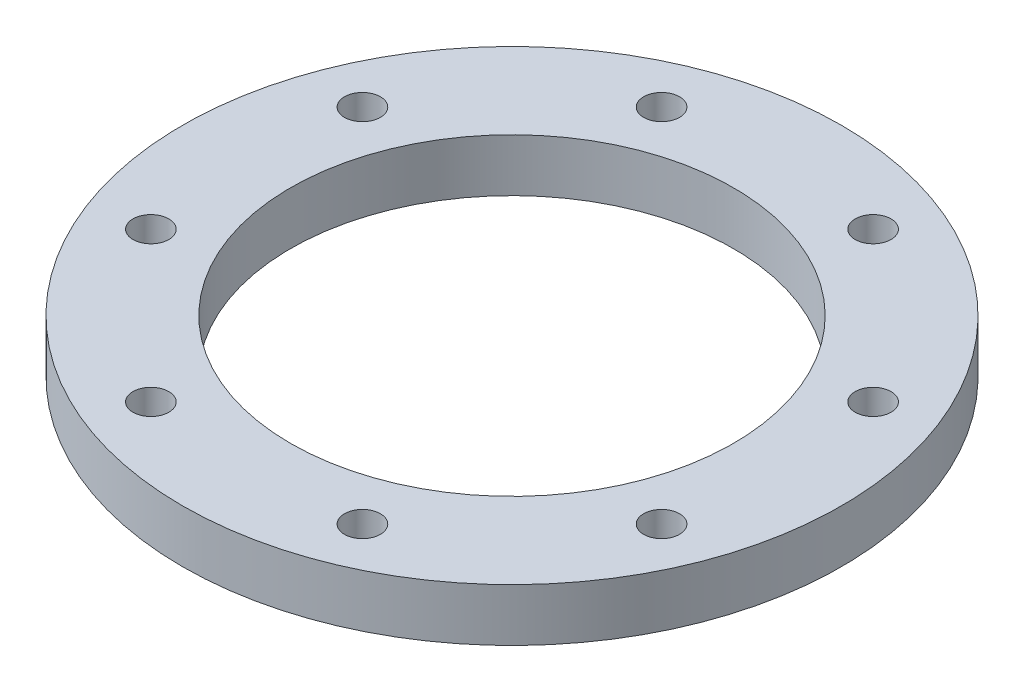
ISO-10303-21;
HEADER;
FILE_DESCRIPTION(('STEP AP214'),'2;1');
FILE_NAME('part.step','',(''),(''),'','','');
FILE_SCHEMA(('AUTOMOTIVE_DESIGN { 1 0 10303 214 1 1 1 1 }'));
ENDSEC;
DATA;
#1=APPLICATION_CONTEXT('core data for automotive mechanical design processes');
#2=APPLICATION_PROTOCOL_DEFINITION('international standard','automotive_design',2000,#1);
#3=PRODUCT_CONTEXT('',#1,'mechanical');
#4=PRODUCT('Part','Part','',(#3));
#5=PRODUCT_RELATED_PRODUCT_CATEGORY('part','',(#4));
#6=PRODUCT_DEFINITION_FORMATION('','',#4);
#7=PRODUCT_DEFINITION_CONTEXT('part definition',#1,'design');
#8=PRODUCT_DEFINITION('design','',#6,#7);
#9=PRODUCT_DEFINITION_SHAPE('','',#8);
#10=(LENGTH_UNIT() NAMED_UNIT(*) SI_UNIT(.MILLI.,.METRE.));
#11=(NAMED_UNIT(*) PLANE_ANGLE_UNIT() SI_UNIT($,.RADIAN.));
#12=(NAMED_UNIT(*) SI_UNIT($,.STERADIAN.) SOLID_ANGLE_UNIT());
#13=UNCERTAINTY_MEASURE_WITH_UNIT(LENGTH_MEASURE(1.E-05),#10,'distance_accuracy_value','');
#14=(GEOMETRIC_REPRESENTATION_CONTEXT(3) GLOBAL_UNCERTAINTY_ASSIGNED_CONTEXT((#13)) GLOBAL_UNIT_ASSIGNED_CONTEXT((#10,
#11,#12)) REPRESENTATION_CONTEXT('',''));
#15=CARTESIAN_POINT('',(0.,0.,0.));
#16=DIRECTION('',(0.,0.,1.));
#17=DIRECTION('',(1.,0.,0.));
#18=AXIS2_PLACEMENT_3D('',#15,#16,#17);
#19=CARTESIAN_POINT('',(-42.,3.38099219620958,0.));
#20=DIRECTION('',(0.,1.,0.));
#21=DIRECTION('',(0.,0.,1.));
#22=AXIS2_PLACEMENT_3D('',#19,#20,#21);
#23=PLANE('',#22);
#24=CARTESIAN_POINT('',(-20.0586392653861,3.38099219620958,-48.4258389572448));
#25=DIRECTION('',(0.,1.,0.));
#26=DIRECTION('',(0.,0.,1.));
#27=AXIS2_PLACEMENT_3D('',#24,#25,#26);
#28=CIRCLE('',#27,3.39999999999999);
#29=CARTESIAN_POINT('',(-20.0586392653861,3.38099219620958,-45.0258389572449));
#30=VERTEX_POINT('',#29);
#31=EDGE_CURVE('E96',#30,#30,#28,.T.);
#32=ORIENTED_EDGE('',*,*,#31,.F.);
#33=EDGE_LOOP('',(#32));
#34=FACE_BOUND('',#33,.T.);
#35=CARTESIAN_POINT('',(20.0586392653862,3.38099219620958,-48.4258389572448));
#36=DIRECTION('',(0.,1.,0.));
#37=DIRECTION('',(0.,0.,1.));
#38=AXIS2_PLACEMENT_3D('',#35,#36,#37);
#39=CIRCLE('',#38,3.39999999999999);
#40=CARTESIAN_POINT('',(20.0586392653862,3.38099219620958,-45.0258389572448));
#41=VERTEX_POINT('',#40);
#42=EDGE_CURVE('E90',#41,#41,#39,.T.);
#43=ORIENTED_EDGE('',*,*,#42,.F.);
#44=EDGE_LOOP('',(#43));
#45=FACE_BOUND('',#44,.T.);
#46=CARTESIAN_POINT('',(48.4258389572448,3.38099219620958,-20.0586392653862));
#47=DIRECTION('',(0.,1.,0.));
#48=DIRECTION('',(0.,0.,1.));
#49=AXIS2_PLACEMENT_3D('',#46,#47,#48);
#50=CIRCLE('',#49,3.39999999999999);
#51=CARTESIAN_POINT('',(48.4258389572448,3.38099219620958,-16.6586392653862));
#52=VERTEX_POINT('',#51);
#53=EDGE_CURVE('E84',#52,#52,#50,.T.);
#54=ORIENTED_EDGE('',*,*,#53,.F.);
#55=EDGE_LOOP('',(#54));
#56=FACE_BOUND('',#55,.T.);
#57=CARTESIAN_POINT('',(48.4258389572448,3.38099219620958,20.0586392653862));
#58=DIRECTION('',(0.,1.,0.));
#59=DIRECTION('',(0.,0.,1.));
#60=AXIS2_PLACEMENT_3D('',#57,#58,#59);
#61=CIRCLE('',#60,3.39999999999999);
#62=CARTESIAN_POINT('',(48.4258389572448,3.38099219620958,23.4586392653862));
#63=VERTEX_POINT('',#62);
#64=EDGE_CURVE('E78',#63,#63,#61,.T.);
#65=ORIENTED_EDGE('',*,*,#64,.F.);
#66=EDGE_LOOP('',(#65));
#67=FACE_BOUND('',#66,.T.);
#68=CARTESIAN_POINT('',(20.0586392653861,3.38099219620958,48.4258389572449));
#69=DIRECTION('',(0.,1.,0.));
#70=DIRECTION('',(0.,0.,1.));
#71=AXIS2_PLACEMENT_3D('',#68,#69,#70);
#72=CIRCLE('',#71,3.39999999999999);
#73=CARTESIAN_POINT('',(20.0586392653861,3.38099219620958,51.8258389572449));
#74=VERTEX_POINT('',#73);
#75=EDGE_CURVE('E72',#74,#74,#72,.T.);
#76=ORIENTED_EDGE('',*,*,#75,.F.);
#77=EDGE_LOOP('',(#76));
#78=FACE_BOUND('',#77,.T.);
#79=CARTESIAN_POINT('',(-20.0586392653862,3.38099219620958,48.4258389572448));
#80=DIRECTION('',(0.,1.,0.));
#81=DIRECTION('',(0.,0.,1.));
#82=AXIS2_PLACEMENT_3D('',#79,#80,#81);
#83=CIRCLE('',#82,3.39999999999999);
#84=CARTESIAN_POINT('',(-20.0586392653862,3.38099219620958,51.8258389572448));
#85=VERTEX_POINT('',#84);
#86=EDGE_CURVE('E66',#85,#85,#83,.T.);
#87=ORIENTED_EDGE('',*,*,#86,.F.);
#88=EDGE_LOOP('',(#87));
#89=FACE_BOUND('',#88,.T.);
#90=CARTESIAN_POINT('',(-48.4258389572448,3.38099219620958,20.0586392653861));
#91=DIRECTION('',(0.,1.,0.));
#92=DIRECTION('',(0.,0.,1.));
#93=AXIS2_PLACEMENT_3D('',#90,#91,#92);
#94=CIRCLE('',#93,3.39999999999999);
#95=CARTESIAN_POINT('',(-48.4258389572448,3.38099219620958,23.4586392653861));
#96=VERTEX_POINT('',#95);
#97=EDGE_CURVE('E60',#96,#96,#94,.T.);
#98=ORIENTED_EDGE('',*,*,#97,.F.);
#99=EDGE_LOOP('',(#98));
#100=FACE_BOUND('',#99,.T.);
#101=CARTESIAN_POINT('',(-48.4258389572448,3.38099219620958,-20.0586392653862));
#102=DIRECTION('',(0.,1.,0.));
#103=DIRECTION('',(0.,0.,1.));
#104=AXIS2_PLACEMENT_3D('',#101,#102,#103);
#105=CIRCLE('',#104,3.39999999999999);
#106=CARTESIAN_POINT('',(-48.4258389572448,3.38099219620958,-16.6586392653862));
#107=VERTEX_POINT('',#106);
#108=EDGE_CURVE('E54',#107,#107,#105,.T.);
#109=ORIENTED_EDGE('',*,*,#108,.F.);
#110=EDGE_LOOP('',(#109));
#111=FACE_BOUND('',#110,.T.);
#112=CARTESIAN_POINT('',(0.,3.38099219620958,0.));
#113=DIRECTION('',(0.,1.,0.));
#114=DIRECTION('',(0.,0.,1.));
#115=AXIS2_PLACEMENT_3D('',#112,#113,#114);
#116=CIRCLE('',#115,62.5);
#117=CARTESIAN_POINT('',(0.,3.38099219620958,62.5));
#118=VERTEX_POINT('',#117);
#119=EDGE_CURVE('E10',#118,#118,#116,.T.);
#120=ORIENTED_EDGE('',*,*,#119,.T.);
#121=EDGE_LOOP('',(#120));
#122=FACE_BOUND('',#121,.T.);
#123=CARTESIAN_POINT('',(0.,3.38099219620958,0.));
#124=DIRECTION('',(0.,1.,0.));
#125=DIRECTION('',(0.,0.,1.));
#126=AXIS2_PLACEMENT_3D('',#123,#124,#125);
#127=CIRCLE('',#126,42.);
#128=CARTESIAN_POINT('',(0.,3.38099219620958,42.));
#129=VERTEX_POINT('',#128);
#130=EDGE_CURVE('E46',#129,#129,#127,.T.);
#131=ORIENTED_EDGE('',*,*,#130,.F.);
#132=EDGE_LOOP('',(#131));
#133=FACE_BOUND('',#132,.T.);
#134=ADVANCED_FACE('F32',(#34,#45,#56,#67,#78,#89,#100,#111,#122,#133),#23,.T.);
#135=CARTESIAN_POINT('',(0.,12.1549052396878,0.));
#136=DIRECTION('',(0.,1.,0.));
#137=DIRECTION('',(0.,0.,1.));
#138=AXIS2_PLACEMENT_3D('',#135,#136,#137);
#139=CYLINDRICAL_SURFACE('',#138,62.5);
#140=CARTESIAN_POINT('',(0.,-6.61900780379042,0.));
#141=DIRECTION('',(0.,1.,0.));
#142=DIRECTION('',(0.,0.,1.));
#143=AXIS2_PLACEMENT_3D('',#140,#141,#142);
#144=CIRCLE('',#143,62.5);
#145=CARTESIAN_POINT('',(0.,-6.61900780379042,62.5));
#146=VERTEX_POINT('',#145);
#147=EDGE_CURVE('E38',#146,#146,#144,.T.);
#148=ORIENTED_EDGE('',*,*,#147,.T.);
#149=EDGE_LOOP('',(#148));
#150=FACE_BOUND('',#149,.T.);
#151=ORIENTED_EDGE('',*,*,#119,.F.);
#152=EDGE_LOOP('',(#151));
#153=FACE_BOUND('',#152,.T.);
#154=ADVANCED_FACE('F104',(#150,#153),#139,.T.);
#155=CARTESIAN_POINT('',(-62.5,-6.61900780379042,0.));
#156=DIRECTION('',(0.,-1.,0.));
#157=DIRECTION('',(0.,0.,-1.));
#158=AXIS2_PLACEMENT_3D('',#155,#156,#157);
#159=PLANE('',#158);
#160=CARTESIAN_POINT('',(-20.0586392653861,-6.61900780379041,-48.4258389572448));
#161=DIRECTION('',(0.,1.,0.));
#162=DIRECTION('',(0.,0.,1.));
#163=AXIS2_PLACEMENT_3D('',#160,#161,#162);
#164=CIRCLE('',#163,3.39999999999999);
#165=CARTESIAN_POINT('',(-20.0586392653861,-6.61900780379041,-45.0258389572449));
#166=VERTEX_POINT('',#165);
#167=EDGE_CURVE('E93',#166,#166,#164,.T.);
#168=ORIENTED_EDGE('',*,*,#167,.T.);
#169=EDGE_LOOP('',(#168));
#170=FACE_BOUND('',#169,.T.);
#171=CARTESIAN_POINT('',(20.0586392653862,-6.61900780379041,-48.4258389572448));
#172=DIRECTION('',(0.,1.,0.));
#173=DIRECTION('',(0.,0.,1.));
#174=AXIS2_PLACEMENT_3D('',#171,#172,#173);
#175=CIRCLE('',#174,3.39999999999999);
#176=CARTESIAN_POINT('',(20.0586392653862,-6.61900780379041,-45.0258389572448));
#177=VERTEX_POINT('',#176);
#178=EDGE_CURVE('E87',#177,#177,#175,.T.);
#179=ORIENTED_EDGE('',*,*,#178,.T.);
#180=EDGE_LOOP('',(#179));
#181=FACE_BOUND('',#180,.T.);
#182=CARTESIAN_POINT('',(48.4258389572448,-6.61900780379041,-20.0586392653862));
#183=DIRECTION('',(0.,1.,0.));
#184=DIRECTION('',(0.,0.,1.));
#185=AXIS2_PLACEMENT_3D('',#182,#183,#184);
#186=CIRCLE('',#185,3.39999999999999);
#187=CARTESIAN_POINT('',(48.4258389572448,-6.61900780379041,-16.6586392653862));
#188=VERTEX_POINT('',#187);
#189=EDGE_CURVE('E81',#188,#188,#186,.T.);
#190=ORIENTED_EDGE('',*,*,#189,.T.);
#191=EDGE_LOOP('',(#190));
#192=FACE_BOUND('',#191,.T.);
#193=CARTESIAN_POINT('',(48.4258389572448,-6.61900780379041,20.0586392653862));
#194=DIRECTION('',(0.,1.,0.));
#195=DIRECTION('',(0.,0.,1.));
#196=AXIS2_PLACEMENT_3D('',#193,#194,#195);
#197=CIRCLE('',#196,3.39999999999999);
#198=CARTESIAN_POINT('',(48.4258389572448,-6.61900780379041,23.4586392653862));
#199=VERTEX_POINT('',#198);
#200=EDGE_CURVE('E75',#199,#199,#197,.T.);
#201=ORIENTED_EDGE('',*,*,#200,.T.);
#202=EDGE_LOOP('',(#201));
#203=FACE_BOUND('',#202,.T.);
#204=CARTESIAN_POINT('',(20.0586392653861,-6.61900780379041,48.4258389572449));
#205=DIRECTION('',(0.,1.,0.));
#206=DIRECTION('',(0.,0.,1.));
#207=AXIS2_PLACEMENT_3D('',#204,#205,#206);
#208=CIRCLE('',#207,3.39999999999999);
#209=CARTESIAN_POINT('',(20.0586392653861,-6.61900780379041,51.8258389572449));
#210=VERTEX_POINT('',#209);
#211=EDGE_CURVE('E69',#210,#210,#208,.T.);
#212=ORIENTED_EDGE('',*,*,#211,.T.);
#213=EDGE_LOOP('',(#212));
#214=FACE_BOUND('',#213,.T.);
#215=CARTESIAN_POINT('',(-20.0586392653862,-6.61900780379041,48.4258389572448));
#216=DIRECTION('',(0.,1.,0.));
#217=DIRECTION('',(0.,0.,1.));
#218=AXIS2_PLACEMENT_3D('',#215,#216,#217);
#219=CIRCLE('',#218,3.39999999999999);
#220=CARTESIAN_POINT('',(-20.0586392653862,-6.61900780379041,51.8258389572448));
#221=VERTEX_POINT('',#220);
#222=EDGE_CURVE('E63',#221,#221,#219,.T.);
#223=ORIENTED_EDGE('',*,*,#222,.T.);
#224=EDGE_LOOP('',(#223));
#225=FACE_BOUND('',#224,.T.);
#226=CARTESIAN_POINT('',(-48.4258389572448,-6.61900780379041,20.0586392653861));
#227=DIRECTION('',(0.,1.,0.));
#228=DIRECTION('',(0.,0.,1.));
#229=AXIS2_PLACEMENT_3D('',#226,#227,#228);
#230=CIRCLE('',#229,3.39999999999999);
#231=CARTESIAN_POINT('',(-48.4258389572448,-6.61900780379041,23.4586392653861));
#232=VERTEX_POINT('',#231);
#233=EDGE_CURVE('E57',#232,#232,#230,.T.);
#234=ORIENTED_EDGE('',*,*,#233,.T.);
#235=EDGE_LOOP('',(#234));
#236=FACE_BOUND('',#235,.T.);
#237=CARTESIAN_POINT('',(-48.4258389572448,-6.61900780379041,-20.0586392653862));
#238=DIRECTION('',(0.,1.,0.));
#239=DIRECTION('',(0.,0.,1.));
#240=AXIS2_PLACEMENT_3D('',#237,#238,#239);
#241=CIRCLE('',#240,3.39999999999999);
#242=CARTESIAN_POINT('',(-48.4258389572448,-6.61900780379041,-16.6586392653862));
#243=VERTEX_POINT('',#242);
#244=EDGE_CURVE('E51',#243,#243,#241,.T.);
#245=ORIENTED_EDGE('',*,*,#244,.T.);
#246=EDGE_LOOP('',(#245));
#247=FACE_BOUND('',#246,.T.);
#248=CARTESIAN_POINT('',(0.,-6.61900780379042,0.));
#249=DIRECTION('',(0.,1.,0.));
#250=DIRECTION('',(0.,0.,1.));
#251=AXIS2_PLACEMENT_3D('',#248,#249,#250);
#252=CIRCLE('',#251,42.);
#253=CARTESIAN_POINT('',(0.,-6.61900780379042,42.));
#254=VERTEX_POINT('',#253);
#255=EDGE_CURVE('E42',#254,#254,#252,.T.);
#256=ORIENTED_EDGE('',*,*,#255,.T.);
#257=EDGE_LOOP('',(#256));
#258=FACE_BOUND('',#257,.T.);
#259=ORIENTED_EDGE('',*,*,#147,.F.);
#260=EDGE_LOOP('',(#259));
#261=FACE_BOUND('',#260,.T.);
#262=ADVANCED_FACE('F125',(#170,#181,#192,#203,#214,#225,#236,#247,#258,#261),#159,.T.);
#263=CARTESIAN_POINT('',(0.,12.1549052396878,0.));
#264=DIRECTION('',(0.,1.,0.));
#265=DIRECTION('',(0.,0.,1.));
#266=AXIS2_PLACEMENT_3D('',#263,#264,#265);
#267=CYLINDRICAL_SURFACE('',#266,42.);
#268=ORIENTED_EDGE('',*,*,#130,.T.);
#269=EDGE_LOOP('',(#268));
#270=FACE_BOUND('',#269,.T.);
#271=ORIENTED_EDGE('',*,*,#255,.F.);
#272=EDGE_LOOP('',(#271));
#273=FACE_BOUND('',#272,.T.);
#274=ADVANCED_FACE('F121',(#270,#273),#267,.F.);
#275=CARTESIAN_POINT('',(-48.4258389572448,3.38099219620958,-20.0586392653862));
#276=DIRECTION('',(0.,1.,0.));
#277=DIRECTION('',(0.,0.,1.));
#278=AXIS2_PLACEMENT_3D('',#275,#276,#277);
#279=CYLINDRICAL_SURFACE('',#278,3.39999999999999);
#280=ORIENTED_EDGE('',*,*,#244,.F.);
#281=EDGE_LOOP('',(#280));
#282=FACE_BOUND('',#281,.T.);
#283=ORIENTED_EDGE('',*,*,#108,.T.);
#284=EDGE_LOOP('',(#283));
#285=FACE_BOUND('',#284,.T.);
#286=ADVANCED_FACE('F124',(#282,#285),#279,.F.);
#287=CARTESIAN_POINT('',(-48.4258389572448,3.38099219620958,20.0586392653861));
#288=DIRECTION('',(0.,1.,0.));
#289=DIRECTION('',(0.,0.,1.));
#290=AXIS2_PLACEMENT_3D('',#287,#288,#289);
#291=CYLINDRICAL_SURFACE('',#290,3.39999999999999);
#292=ORIENTED_EDGE('',*,*,#233,.F.);
#293=EDGE_LOOP('',(#292));
#294=FACE_BOUND('',#293,.T.);
#295=ORIENTED_EDGE('',*,*,#97,.T.);
#296=EDGE_LOOP('',(#295));
#297=FACE_BOUND('',#296,.T.);
#298=ADVANCED_FACE('F140',(#294,#297),#291,.F.);
#299=CARTESIAN_POINT('',(-20.0586392653862,3.38099219620958,48.4258389572448));
#300=DIRECTION('',(0.,1.,0.));
#301=DIRECTION('',(0.,0.,1.));
#302=AXIS2_PLACEMENT_3D('',#299,#300,#301);
#303=CYLINDRICAL_SURFACE('',#302,3.39999999999999);
#304=ORIENTED_EDGE('',*,*,#222,.F.);
#305=EDGE_LOOP('',(#304));
#306=FACE_BOUND('',#305,.T.);
#307=ORIENTED_EDGE('',*,*,#86,.T.);
#308=EDGE_LOOP('',(#307));
#309=FACE_BOUND('',#308,.T.);
#310=ADVANCED_FACE('F144',(#306,#309),#303,.F.);
#311=CARTESIAN_POINT('',(20.0586392653861,3.38099219620958,48.4258389572449));
#312=DIRECTION('',(0.,1.,0.));
#313=DIRECTION('',(0.,0.,1.));
#314=AXIS2_PLACEMENT_3D('',#311,#312,#313);
#315=CYLINDRICAL_SURFACE('',#314,3.39999999999999);
#316=ORIENTED_EDGE('',*,*,#211,.F.);
#317=EDGE_LOOP('',(#316));
#318=FACE_BOUND('',#317,.T.);
#319=ORIENTED_EDGE('',*,*,#75,.T.);
#320=EDGE_LOOP('',(#319));
#321=FACE_BOUND('',#320,.T.);
#322=ADVANCED_FACE('F148',(#318,#321),#315,.F.);
#323=CARTESIAN_POINT('',(48.4258389572448,3.38099219620958,20.0586392653862));
#324=DIRECTION('',(0.,1.,0.));
#325=DIRECTION('',(0.,0.,1.));
#326=AXIS2_PLACEMENT_3D('',#323,#324,#325);
#327=CYLINDRICAL_SURFACE('',#326,3.39999999999999);
#328=ORIENTED_EDGE('',*,*,#200,.F.);
#329=EDGE_LOOP('',(#328));
#330=FACE_BOUND('',#329,.T.);
#331=ORIENTED_EDGE('',*,*,#64,.T.);
#332=EDGE_LOOP('',(#331));
#333=FACE_BOUND('',#332,.T.);
#334=ADVANCED_FACE('F152',(#330,#333),#327,.F.);
#335=CARTESIAN_POINT('',(48.4258389572448,3.38099219620958,-20.0586392653862));
#336=DIRECTION('',(0.,1.,0.));
#337=DIRECTION('',(0.,0.,1.));
#338=AXIS2_PLACEMENT_3D('',#335,#336,#337);
#339=CYLINDRICAL_SURFACE('',#338,3.39999999999999);
#340=ORIENTED_EDGE('',*,*,#189,.F.);
#341=EDGE_LOOP('',(#340));
#342=FACE_BOUND('',#341,.T.);
#343=ORIENTED_EDGE('',*,*,#53,.T.);
#344=EDGE_LOOP('',(#343));
#345=FACE_BOUND('',#344,.T.);
#346=ADVANCED_FACE('F156',(#342,#345),#339,.F.);
#347=CARTESIAN_POINT('',(20.0586392653862,3.38099219620958,-48.4258389572448));
#348=DIRECTION('',(0.,1.,0.));
#349=DIRECTION('',(0.,0.,1.));
#350=AXIS2_PLACEMENT_3D('',#347,#348,#349);
#351=CYLINDRICAL_SURFACE('',#350,3.39999999999999);
#352=ORIENTED_EDGE('',*,*,#178,.F.);
#353=EDGE_LOOP('',(#352));
#354=FACE_BOUND('',#353,.T.);
#355=ORIENTED_EDGE('',*,*,#42,.T.);
#356=EDGE_LOOP('',(#355));
#357=FACE_BOUND('',#356,.T.);
#358=ADVANCED_FACE('F160',(#354,#357),#351,.F.);
#359=CARTESIAN_POINT('',(-20.0586392653861,3.38099219620958,-48.4258389572448));
#360=DIRECTION('',(0.,1.,0.));
#361=DIRECTION('',(0.,0.,1.));
#362=AXIS2_PLACEMENT_3D('',#359,#360,#361);
#363=CYLINDRICAL_SURFACE('',#362,3.39999999999999);
#364=ORIENTED_EDGE('',*,*,#167,.F.);
#365=EDGE_LOOP('',(#364));
#366=FACE_BOUND('',#365,.T.);
#367=ORIENTED_EDGE('',*,*,#31,.T.);
#368=EDGE_LOOP('',(#367));
#369=FACE_BOUND('',#368,.T.);
#370=ADVANCED_FACE('F100',(#366,#369),#363,.F.);
#371=CLOSED_SHELL('',(#134,#154,#262,#274,#286,#298,#310,#322,#334,#346,#358,#370));
#372=MANIFOLD_SOLID_BREP('B2',#371);
#373=ADVANCED_BREP_SHAPE_REPRESENTATION('',(#18,#372),#14);
#374=SHAPE_DEFINITION_REPRESENTATION(#9,#373);
ENDSEC;
END-ISO-10303-21;
